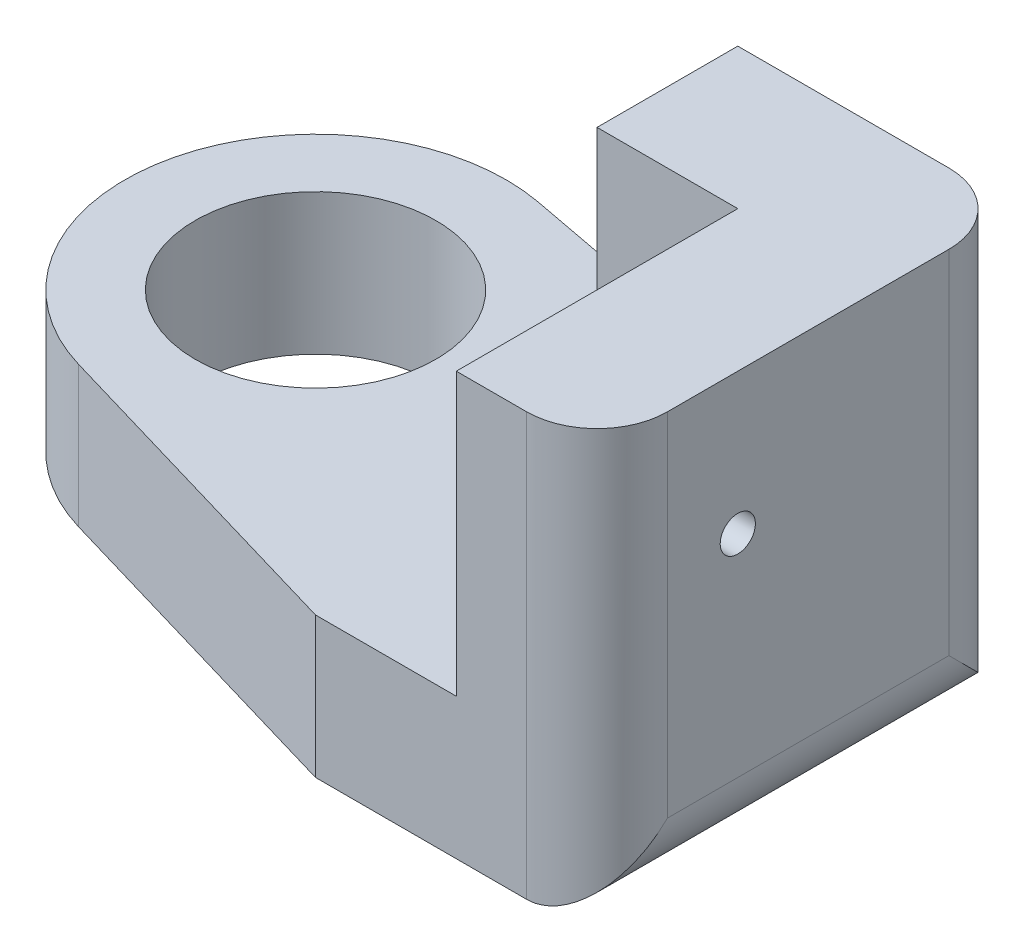
ISO-10303-21;
HEADER;
FILE_DESCRIPTION(('STEP AP214'),'2;1');
FILE_NAME('part.step','',(''),(''),'','','');
FILE_SCHEMA(('AUTOMOTIVE_DESIGN { 1 0 10303 214 1 1 1 1 }'));
ENDSEC;
DATA;
#1=APPLICATION_CONTEXT('core data for automotive mechanical design processes');
#2=APPLICATION_PROTOCOL_DEFINITION('international standard','automotive_design',2000,#1);
#3=PRODUCT_CONTEXT('',#1,'mechanical');
#4=PRODUCT('Part','Part','',(#3));
#5=PRODUCT_RELATED_PRODUCT_CATEGORY('part','',(#4));
#6=PRODUCT_DEFINITION_FORMATION('','',#4);
#7=PRODUCT_DEFINITION_CONTEXT('part definition',#1,'design');
#8=PRODUCT_DEFINITION('design','',#6,#7);
#9=PRODUCT_DEFINITION_SHAPE('','',#8);
#10=(LENGTH_UNIT() NAMED_UNIT(*) SI_UNIT(.MILLI.,.METRE.));
#11=(NAMED_UNIT(*) PLANE_ANGLE_UNIT() SI_UNIT($,.RADIAN.));
#12=(NAMED_UNIT(*) SI_UNIT($,.STERADIAN.) SOLID_ANGLE_UNIT());
#13=UNCERTAINTY_MEASURE_WITH_UNIT(LENGTH_MEASURE(1.E-05),#10,'distance_accuracy_value','');
#14=(GEOMETRIC_REPRESENTATION_CONTEXT(3) GLOBAL_UNCERTAINTY_ASSIGNED_CONTEXT((#13)) GLOBAL_UNIT_ASSIGNED_CONTEXT((#10,
#11,#12)) REPRESENTATION_CONTEXT('',''));
#15=CARTESIAN_POINT('',(0.,0.,0.));
#16=DIRECTION('',(0.,0.,1.));
#17=DIRECTION('',(1.,0.,0.));
#18=AXIS2_PLACEMENT_3D('',#15,#16,#17);
#19=CARTESIAN_POINT('',(0.,10.,0.));
#20=DIRECTION('',(1.,0.,0.));
#21=DIRECTION('',(0.,0.,-1.));
#22=AXIS2_PLACEMENT_3D('',#19,#20,#21);
#23=PLANE('',#22);
#24=DIRECTION('',(0.,-1.,0.));
#25=VECTOR('',#24,1.);
#26=CARTESIAN_POINT('',(0.,10.,0.));
#27=LINE('',#26,#25);
#28=CARTESIAN_POINT('',(0.,30.,0.));
#29=VERTEX_POINT('',#28);
#30=CARTESIAN_POINT('',(0.,15.,0.));
#31=VERTEX_POINT('',#30);
#32=EDGE_CURVE('E245',#29,#31,#27,.T.);
#33=ORIENTED_EDGE('',*,*,#32,.T.);
#34=DIRECTION('',(0.,0.,-1.));
#35=VECTOR('',#34,1.);
#36=CARTESIAN_POINT('',(0.,15.,0.));
#37=LINE('',#36,#35);
#38=CARTESIAN_POINT('',(0.,15.,10.));
#39=VERTEX_POINT('',#38);
#40=EDGE_CURVE('E261',#31,#39,#37,.F.);
#41=ORIENTED_EDGE('',*,*,#40,.T.);
#42=DIRECTION('',(0.,-1.,0.));
#43=VECTOR('',#42,1.);
#44=CARTESIAN_POINT('',(0.,20.,10.));
#45=LINE('',#44,#43);
#46=CARTESIAN_POINT('',(0.,30.,10.));
#47=VERTEX_POINT('',#46);
#48=EDGE_CURVE('E237',#47,#39,#45,.T.);
#49=ORIENTED_EDGE('',*,*,#48,.F.);
#50=DIRECTION('',(0.,0.,1.));
#51=VECTOR('',#50,1.);
#52=CARTESIAN_POINT('',(0.,30.,0.));
#53=LINE('',#52,#51);
#54=EDGE_CURVE('E185',#29,#47,#53,.T.);
#55=ORIENTED_EDGE('',*,*,#54,.F.);
#56=EDGE_LOOP('',(#33,#41,#49,#55));
#57=FACE_BOUND('',#56,.T.);
#58=ADVANCED_FACE('F39',(#57),#23,.F.);
#59=CARTESIAN_POINT('',(0.,10.,30.));
#60=DIRECTION('',(0.,0.,-1.));
#61=DIRECTION('',(-1.,0.,0.));
#62=AXIS2_PLACEMENT_3D('',#59,#60,#61);
#63=PLANE('',#62);
#64=DIRECTION('',(1.,0.,0.));
#65=VECTOR('',#64,1.);
#66=CARTESIAN_POINT('',(0.,0.,30.));
#67=LINE('',#66,#65);
#68=CARTESIAN_POINT('',(0.,0.,30.));
#69=VERTEX_POINT('',#68);
#70=CARTESIAN_POINT('',(15.,0.,30.));
#71=VERTEX_POINT('',#70);
#72=EDGE_CURVE('E241',#69,#71,#67,.T.);
#73=ORIENTED_EDGE('',*,*,#72,.T.);
#74=DIRECTION('',(0.,-1.,0.));
#75=VECTOR('',#74,1.);
#76=CARTESIAN_POINT('',(15.,10.,30.));
#77=LINE('',#76,#75);
#78=CARTESIAN_POINT('',(15.,30.,30.));
#79=VERTEX_POINT('',#78);
#80=EDGE_CURVE('E150',#71,#79,#77,.F.);
#81=ORIENTED_EDGE('',*,*,#80,.T.);
#82=DIRECTION('',(1.,0.,0.));
#83=VECTOR('',#82,1.);
#84=CARTESIAN_POINT('',(10.,30.,30.));
#85=LINE('',#84,#83);
#86=CARTESIAN_POINT('',(10.,30.,30.));
#87=VERTEX_POINT('',#86);
#88=EDGE_CURVE('E146',#87,#79,#85,.T.);
#89=ORIENTED_EDGE('',*,*,#88,.F.);
#90=DIRECTION('',(0.,-1.,0.));
#91=VECTOR('',#90,1.);
#92=CARTESIAN_POINT('',(10.,20.,30.));
#93=LINE('',#92,#91);
#94=CARTESIAN_POINT('',(10.,10.,30.));
#95=VERTEX_POINT('',#94);
#96=EDGE_CURVE('E134',#87,#95,#93,.T.);
#97=ORIENTED_EDGE('',*,*,#96,.T.);
#98=DIRECTION('',(1.,0.,0.));
#99=VECTOR('',#98,1.);
#100=CARTESIAN_POINT('',(0.,10.,30.));
#101=LINE('',#100,#99);
#102=CARTESIAN_POINT('',(0.,10.,30.));
#103=VERTEX_POINT('',#102);
#104=EDGE_CURVE('E242',#103,#95,#101,.T.);
#105=ORIENTED_EDGE('',*,*,#104,.F.);
#106=DIRECTION('',(0.,-1.,0.));
#107=VECTOR('',#106,1.);
#108=CARTESIAN_POINT('',(0.,10.,30.));
#109=LINE('',#108,#107);
#110=EDGE_CURVE('E253',#103,#69,#109,.T.);
#111=ORIENTED_EDGE('',*,*,#110,.T.);
#112=EDGE_LOOP('',(#73,#81,#89,#97,#105,#111));
#113=FACE_BOUND('',#112,.T.);
#114=ADVANCED_FACE('F148',(#113),#63,.F.);
#115=CARTESIAN_POINT('',(20.,10.,0.));
#116=DIRECTION('',(-1.,0.,0.));
#117=DIRECTION('',(0.,0.,1.));
#118=AXIS2_PLACEMENT_3D('',#115,#116,#117);
#119=PLANE('',#118);
#120=CARTESIAN_POINT('',(20.,20.,20.));
#121=DIRECTION('',(-1.,0.,0.));
#122=DIRECTION('',(0.,0.,1.));
#123=AXIS2_PLACEMENT_3D('',#120,#121,#122);
#124=CIRCLE('',#123,1.25);
#125=CARTESIAN_POINT('',(20.,20.,21.25));
#126=VERTEX_POINT('',#125);
#127=EDGE_CURVE('E163',#126,#126,#124,.F.);
#128=ORIENTED_EDGE('',*,*,#127,.F.);
#129=EDGE_LOOP('',(#128));
#130=FACE_BOUND('',#129,.T.);
#131=DIRECTION('',(0.,-1.,0.));
#132=VECTOR('',#131,1.);
#133=CARTESIAN_POINT('',(20.,10.,5.));
#134=LINE('',#133,#132);
#135=CARTESIAN_POINT('',(20.,5.,5.));
#136=VERTEX_POINT('',#135);
#137=CARTESIAN_POINT('',(20.,30.,5.));
#138=VERTEX_POINT('',#137);
#139=EDGE_CURVE('E264',#136,#138,#134,.F.);
#140=ORIENTED_EDGE('',*,*,#139,.T.);
#141=DIRECTION('',(0.,0.,-1.));
#142=VECTOR('',#141,1.);
#143=CARTESIAN_POINT('',(20.,30.,25.));
#144=LINE('',#143,#142);
#145=CARTESIAN_POINT('',(20.,30.,25.));
#146=VERTEX_POINT('',#145);
#147=EDGE_CURVE('E173',#146,#138,#144,.T.);
#148=ORIENTED_EDGE('',*,*,#147,.F.);
#149=DIRECTION('',(0.,-1.,0.));
#150=VECTOR('',#149,1.);
#151=CARTESIAN_POINT('',(20.,10.,25.));
#152=LINE('',#151,#150);
#153=CARTESIAN_POINT('',(20.,5.,25.));
#154=VERTEX_POINT('',#153);
#155=EDGE_CURVE('E271',#146,#154,#152,.T.);
#156=ORIENTED_EDGE('',*,*,#155,.T.);
#157=DIRECTION('',(0.,0.,-1.));
#158=VECTOR('',#157,1.);
#159=CARTESIAN_POINT('',(20.,5.,0.));
#160=LINE('',#159,#158);
#161=EDGE_CURVE('E267',#154,#136,#160,.T.);
#162=ORIENTED_EDGE('',*,*,#161,.T.);
#163=EDGE_LOOP('',(#140,#148,#156,#162));
#164=FACE_BOUND('',#163,.T.);
#165=ADVANCED_FACE('F297',(#130,#164),#119,.F.);
#166=CARTESIAN_POINT('',(0.,10.,0.));
#167=DIRECTION('',(0.,0.,1.));
#168=DIRECTION('',(1.,0.,0.));
#169=AXIS2_PLACEMENT_3D('',#166,#167,#168);
#170=PLANE('',#169);
#171=ORIENTED_EDGE('',*,*,#32,.F.);
#172=DIRECTION('',(-1.,0.,0.));
#173=VECTOR('',#172,1.);
#174=CARTESIAN_POINT('',(15.,30.,0.));
#175=LINE('',#174,#173);
#176=CARTESIAN_POINT('',(15.,30.,0.));
#177=VERTEX_POINT('',#176);
#178=EDGE_CURVE('E181',#177,#29,#175,.T.);
#179=ORIENTED_EDGE('',*,*,#178,.F.);
#180=DIRECTION('',(0.,-1.,0.));
#181=VECTOR('',#180,1.);
#182=CARTESIAN_POINT('',(15.,10.,0.));
#183=LINE('',#182,#181);
#184=CARTESIAN_POINT('',(15.,0.,0.));
#185=VERTEX_POINT('',#184);
#186=EDGE_CURVE('E63',#177,#185,#183,.T.);
#187=ORIENTED_EDGE('',*,*,#186,.T.);
#188=DIRECTION('',(-1.,0.,0.));
#189=VECTOR('',#188,1.);
#190=CARTESIAN_POINT('',(0.,0.,0.));
#191=LINE('',#190,#189);
#192=CARTESIAN_POINT('',(0.,0.,0.));
#193=VERTEX_POINT('',#192);
#194=EDGE_CURVE('E246',#185,#193,#191,.T.);
#195=ORIENTED_EDGE('',*,*,#194,.T.);
#196=DIRECTION('',(0.,1.,0.));
#197=VECTOR('',#196,1.);
#198=CARTESIAN_POINT('',(0.,-47.4468650176173,0.));
#199=LINE('',#198,#197);
#200=EDGE_CURVE('E57',#193,#31,#199,.T.);
#201=ORIENTED_EDGE('',*,*,#200,.T.);
#202=EDGE_LOOP('',(#171,#179,#187,#195,#201));
#203=FACE_BOUND('',#202,.T.);
#204=ADVANCED_FACE('F301',(#203),#170,.F.);
#205=CARTESIAN_POINT('',(0.,10.,0.));
#206=DIRECTION('',(0.,1.,0.));
#207=DIRECTION('',(0.,0.,1.));
#208=AXIS2_PLACEMENT_3D('',#205,#206,#207);
#209=PLANE('',#208);
#210=DIRECTION('',(1.,0.,0.));
#211=VECTOR('',#210,1.);
#212=CARTESIAN_POINT('',(0.,10.,10.));
#213=LINE('',#212,#211);
#214=CARTESIAN_POINT('',(-5.,10.,10.));
#215=VERTEX_POINT('',#214);
#216=CARTESIAN_POINT('',(10.,10.,10.));
#217=VERTEX_POINT('',#216);
#218=EDGE_CURVE('E229',#215,#217,#213,.T.);
#219=ORIENTED_EDGE('',*,*,#218,.F.);
#220=DIRECTION('',(0.,0.,-1.));
#221=VECTOR('',#220,1.);
#222=CARTESIAN_POINT('',(-5.,10.,0.));
#223=LINE('',#222,#221);
#224=CARTESIAN_POINT('',(-5.,10.,-0.947812380366816));
#225=VERTEX_POINT('',#224);
#226=EDGE_CURVE('E257',#215,#225,#223,.T.);
#227=ORIENTED_EDGE('',*,*,#226,.T.);
#228=DIRECTION('',(-0.982503193400875,0.,-0.186245738091056));
#229=VECTOR('',#228,1.);
#230=CARTESIAN_POINT('',(0.,10.,0.));
#231=LINE('',#230,#229);
#232=CARTESIAN_POINT('',(-17.5137222803635,10.,-3.31994456072693));
#233=VERTEX_POINT('',#232);
#234=EDGE_CURVE('E207',#225,#233,#231,.T.);
#235=ORIENTED_EDGE('',*,*,#234,.T.);
#236=CARTESIAN_POINT('',(-20.,10.,10.));
#237=DIRECTION('',(0.,1.,0.));
#238=DIRECTION('',(0.,0.,1.));
#239=AXIS2_PLACEMENT_3D('',#236,#237,#238);
#240=CIRCLE('',#239,13.55);
#241=CARTESIAN_POINT('',(-23.8463629734088,10.,22.9926129734088));
#242=VERTEX_POINT('',#241);
#243=EDGE_CURVE('E210',#233,#242,#240,.T.);
#244=ORIENTED_EDGE('',*,*,#243,.T.);
#245=DIRECTION('',(0.959433535303502,0.,0.28193490620181));
#246=VECTOR('',#245,1.);
#247=CARTESIAN_POINT('',(0.,10.,30.));
#248=LINE('',#247,#246);
#249=EDGE_CURVE('E214',#242,#103,#248,.T.);
#250=ORIENTED_EDGE('',*,*,#249,.T.);
#251=ORIENTED_EDGE('',*,*,#104,.T.);
#252=DIRECTION('',(0.,0.,1.));
#253=VECTOR('',#252,1.);
#254=CARTESIAN_POINT('',(10.,10.,10.));
#255=LINE('',#254,#253);
#256=EDGE_CURVE('E140',#217,#95,#255,.T.);
#257=ORIENTED_EDGE('',*,*,#256,.F.);
#258=EDGE_LOOP('',(#219,#227,#235,#244,#250,#251,#257));
#259=FACE_BOUND('',#258,.T.);
#260=CARTESIAN_POINT('',(-20.,10.,10.));
#261=DIRECTION('',(0.,1.,0.));
#262=DIRECTION('',(0.,0.,1.));
#263=AXIS2_PLACEMENT_3D('',#260,#261,#262);
#264=CIRCLE('',#263,8.55);
#265=CARTESIAN_POINT('',(-20.,10.,18.55));
#266=VERTEX_POINT('',#265);
#267=EDGE_CURVE('E203',#266,#266,#264,.T.);
#268=ORIENTED_EDGE('',*,*,#267,.F.);
#269=EDGE_LOOP('',(#268));
#270=FACE_BOUND('',#269,.T.);
#271=ADVANCED_FACE('F315',(#259,#270),#209,.T.);
#272=CARTESIAN_POINT('',(0.,0.,0.));
#273=DIRECTION('',(0.,1.,0.));
#274=DIRECTION('',(0.,0.,1.));
#275=AXIS2_PLACEMENT_3D('',#272,#273,#274);
#276=PLANE('',#275);
#277=ORIENTED_EDGE('',*,*,#194,.F.);
#278=DIRECTION('',(0.,0.,-1.));
#279=VECTOR('',#278,1.);
#280=CARTESIAN_POINT('',(15.,0.,0.));
#281=LINE('',#280,#279);
#282=EDGE_CURVE('E274',#185,#71,#281,.F.);
#283=ORIENTED_EDGE('',*,*,#282,.T.);
#284=ORIENTED_EDGE('',*,*,#72,.F.);
#285=DIRECTION('',(-0.959433535303502,0.,-0.28193490620181));
#286=VECTOR('',#285,1.);
#287=CARTESIAN_POINT('',(0.,0.,30.));
#288=LINE('',#287,#286);
#289=CARTESIAN_POINT('',(-23.8463629734088,0.,22.9926129734088));
#290=VERTEX_POINT('',#289);
#291=EDGE_CURVE('E196',#69,#290,#288,.T.);
#292=ORIENTED_EDGE('',*,*,#291,.T.);
#293=CARTESIAN_POINT('',(-20.,0.,10.));
#294=DIRECTION('',(0.,1.,0.));
#295=DIRECTION('',(0.,0.,1.));
#296=AXIS2_PLACEMENT_3D('',#293,#294,#295);
#297=CIRCLE('',#296,13.55);
#298=CARTESIAN_POINT('',(-17.5137222803635,0.,-3.31994456072693));
#299=VERTEX_POINT('',#298);
#300=EDGE_CURVE('E197',#290,#299,#297,.F.);
#301=ORIENTED_EDGE('',*,*,#300,.T.);
#302=DIRECTION('',(0.982503193400875,0.,0.186245738091056));
#303=VECTOR('',#302,1.);
#304=CARTESIAN_POINT('',(0.,0.,0.));
#305=LINE('',#304,#303);
#306=EDGE_CURVE('E191',#299,#193,#305,.T.);
#307=ORIENTED_EDGE('',*,*,#306,.T.);
#308=EDGE_LOOP('',(#277,#283,#284,#292,#301,#307));
#309=FACE_BOUND('',#308,.T.);
#310=CARTESIAN_POINT('',(-20.,0.,10.));
#311=DIRECTION('',(0.,1.,0.));
#312=DIRECTION('',(0.,0.,1.));
#313=AXIS2_PLACEMENT_3D('',#310,#311,#312);
#314=CIRCLE('',#313,8.55);
#315=CARTESIAN_POINT('',(-20.,0.,18.55));
#316=VERTEX_POINT('',#315);
#317=EDGE_CURVE('E195',#316,#316,#314,.F.);
#318=ORIENTED_EDGE('',*,*,#317,.F.);
#319=EDGE_LOOP('',(#318));
#320=FACE_BOUND('',#319,.T.);
#321=ADVANCED_FACE('F325',(#309,#320),#276,.F.);
#322=CARTESIAN_POINT('',(0.,20.,10.));
#323=DIRECTION('',(0.,0.,-1.));
#324=DIRECTION('',(-1.,0.,0.));
#325=AXIS2_PLACEMENT_3D('',#322,#323,#324);
#326=PLANE('',#325);
#327=ORIENTED_EDGE('',*,*,#218,.T.);
#328=DIRECTION('',(0.,-1.,0.));
#329=VECTOR('',#328,1.);
#330=CARTESIAN_POINT('',(10.,20.,10.));
#331=LINE('',#330,#329);
#332=CARTESIAN_POINT('',(10.,30.,10.));
#333=VERTEX_POINT('',#332);
#334=EDGE_CURVE('E143',#333,#217,#331,.T.);
#335=ORIENTED_EDGE('',*,*,#334,.F.);
#336=DIRECTION('',(1.,0.,0.));
#337=VECTOR('',#336,1.);
#338=CARTESIAN_POINT('',(0.,30.,10.));
#339=LINE('',#338,#337);
#340=EDGE_CURVE('E161',#47,#333,#339,.T.);
#341=ORIENTED_EDGE('',*,*,#340,.F.);
#342=ORIENTED_EDGE('',*,*,#48,.T.);
#343=CARTESIAN_POINT('',(-5.,15.,10.));
#344=DIRECTION('',(0.,0.,-1.));
#345=DIRECTION('',(-1.,0.,0.));
#346=AXIS2_PLACEMENT_3D('',#343,#344,#345);
#347=CIRCLE('',#346,5.);
#348=EDGE_CURVE('E11',#39,#215,#347,.T.);
#349=ORIENTED_EDGE('',*,*,#348,.T.);
#350=EDGE_LOOP('',(#327,#335,#341,#342,#349));
#351=FACE_BOUND('',#350,.T.);
#352=ADVANCED_FACE('F313',(#351),#326,.F.);
#353=CARTESIAN_POINT('',(10.,20.,10.));
#354=DIRECTION('',(1.,0.,0.));
#355=DIRECTION('',(0.,0.,-1.));
#356=AXIS2_PLACEMENT_3D('',#353,#354,#355);
#357=PLANE('',#356);
#358=CARTESIAN_POINT('',(10.,20.,20.));
#359=DIRECTION('',(-1.,0.,0.));
#360=DIRECTION('',(0.,0.,1.));
#361=AXIS2_PLACEMENT_3D('',#358,#359,#360);
#362=CIRCLE('',#361,1.25);
#363=CARTESIAN_POINT('',(10.,20.,21.25));
#364=VERTEX_POINT('',#363);
#365=EDGE_CURVE('E167',#364,#364,#362,.T.);
#366=ORIENTED_EDGE('',*,*,#365,.F.);
#367=EDGE_LOOP('',(#366));
#368=FACE_BOUND('',#367,.T.);
#369=ORIENTED_EDGE('',*,*,#256,.T.);
#370=ORIENTED_EDGE('',*,*,#96,.F.);
#371=DIRECTION('',(0.,0.,1.));
#372=VECTOR('',#371,1.);
#373=CARTESIAN_POINT('',(10.,30.,10.));
#374=LINE('',#373,#372);
#375=EDGE_CURVE('E139',#333,#87,#374,.T.);
#376=ORIENTED_EDGE('',*,*,#375,.F.);
#377=ORIENTED_EDGE('',*,*,#334,.T.);
#378=EDGE_LOOP('',(#369,#370,#376,#377));
#379=FACE_BOUND('',#378,.T.);
#380=ADVANCED_FACE('F136',(#368,#379),#357,.F.);
#381=CARTESIAN_POINT('',(0.,-47.4468650176173,0.));
#382=DIRECTION('',(0.186245738091056,0.,-0.982503193400875));
#383=DIRECTION('',(-0.982503193400875,0.,-0.186245738091056));
#384=AXIS2_PLACEMENT_3D('',#381,#382,#383);
#385=PLANE('',#384);
#386=ORIENTED_EDGE('',*,*,#306,.F.);
#387=DIRECTION('',(0.,1.,0.));
#388=VECTOR('',#387,1.);
#389=CARTESIAN_POINT('',(-17.5137222803635,-47.4468650176173,-3.31994456072693));
#390=LINE('',#389,#388);
#391=EDGE_CURVE('E220',#299,#233,#390,.T.);
#392=ORIENTED_EDGE('',*,*,#391,.T.);
#393=ORIENTED_EDGE('',*,*,#234,.F.);
#394=CARTESIAN_POINT('',(-5.,15.,-0.947812380366816));
#395=DIRECTION('',(0.186245738091056,0.,-0.982503193400875));
#396=DIRECTION('',(-0.982503193400875,0.,-0.186245738091056));
#397=AXIS2_PLACEMENT_3D('',#394,#395,#396);
#398=ELLIPSE('',#397,5.08904198335763,5.);
#399=EDGE_CURVE('E49',#225,#31,#398,.F.);
#400=ORIENTED_EDGE('',*,*,#399,.T.);
#401=ORIENTED_EDGE('',*,*,#200,.F.);
#402=EDGE_LOOP('',(#386,#392,#393,#400,#401));
#403=FACE_BOUND('',#402,.T.);
#404=ADVANCED_FACE('F307',(#403),#385,.T.);
#405=CARTESIAN_POINT('',(-20.,-47.4468650176173,10.));
#406=DIRECTION('',(0.,1.,0.));
#407=DIRECTION('',(0.,0.,1.));
#408=AXIS2_PLACEMENT_3D('',#405,#406,#407);
#409=CYLINDRICAL_SURFACE('',#408,13.55);
#410=ORIENTED_EDGE('',*,*,#300,.F.);
#411=DIRECTION('',(0.,1.,0.));
#412=VECTOR('',#411,1.);
#413=CARTESIAN_POINT('',(-23.8463629734088,-47.4468650176173,22.9926129734088));
#414=LINE('',#413,#412);
#415=EDGE_CURVE('E200',#290,#242,#414,.T.);
#416=ORIENTED_EDGE('',*,*,#415,.T.);
#417=ORIENTED_EDGE('',*,*,#243,.F.);
#418=ORIENTED_EDGE('',*,*,#391,.F.);
#419=EDGE_LOOP('',(#410,#416,#417,#418));
#420=FACE_BOUND('',#419,.T.);
#421=ADVANCED_FACE('F329',(#420),#409,.T.);
#422=CARTESIAN_POINT('',(0.,-47.4468650176173,30.));
#423=DIRECTION('',(-0.28193490620181,0.,0.959433535303502));
#424=DIRECTION('',(0.959433535303502,0.,0.28193490620181));
#425=AXIS2_PLACEMENT_3D('',#422,#423,#424);
#426=PLANE('',#425);
#427=ORIENTED_EDGE('',*,*,#291,.F.);
#428=ORIENTED_EDGE('',*,*,#110,.F.);
#429=ORIENTED_EDGE('',*,*,#249,.F.);
#430=ORIENTED_EDGE('',*,*,#415,.F.);
#431=EDGE_LOOP('',(#427,#428,#429,#430));
#432=FACE_BOUND('',#431,.T.);
#433=ADVANCED_FACE('F321',(#432),#426,.T.);
#434=CARTESIAN_POINT('',(-20.,-47.4468650176173,10.));
#435=DIRECTION('',(0.,1.,0.));
#436=DIRECTION('',(0.,0.,1.));
#437=AXIS2_PLACEMENT_3D('',#434,#435,#436);
#438=CYLINDRICAL_SURFACE('',#437,8.55);
#439=ORIENTED_EDGE('',*,*,#317,.T.);
#440=EDGE_LOOP('',(#439));
#441=FACE_BOUND('',#440,.T.);
#442=ORIENTED_EDGE('',*,*,#267,.T.);
#443=EDGE_LOOP('',(#442));
#444=FACE_BOUND('',#443,.T.);
#445=ADVANCED_FACE('F337',(#441,#444),#438,.F.);
#446=CARTESIAN_POINT('',(-5.,15.,0.));
#447=DIRECTION('',(0.,0.,-1.));
#448=DIRECTION('',(-1.,0.,0.));
#449=AXIS2_PLACEMENT_3D('',#446,#447,#448);
#450=CYLINDRICAL_SURFACE('',#449,5.);
#451=ORIENTED_EDGE('',*,*,#348,.F.);
#452=ORIENTED_EDGE('',*,*,#40,.F.);
#453=ORIENTED_EDGE('',*,*,#399,.F.);
#454=ORIENTED_EDGE('',*,*,#226,.F.);
#455=EDGE_LOOP('',(#451,#452,#453,#454));
#456=FACE_BOUND('',#455,.T.);
#457=ADVANCED_FACE('F311',(#456),#450,.F.);
#458=CARTESIAN_POINT('',(15.,10.,25.));
#459=DIRECTION('',(0.,-1.,0.));
#460=DIRECTION('',(0.,0.,-1.));
#461=AXIS2_PLACEMENT_3D('',#458,#459,#460);
#462=CYLINDRICAL_SURFACE('',#461,5.);
#463=ORIENTED_EDGE('',*,*,#155,.F.);
#464=CARTESIAN_POINT('',(15.,30.,25.));
#465=DIRECTION('',(0.,1.,0.));
#466=DIRECTION('',(0.,0.,1.));
#467=AXIS2_PLACEMENT_3D('',#464,#465,#466);
#468=CIRCLE('',#467,5.);
#469=EDGE_CURVE('E155',#79,#146,#468,.T.);
#470=ORIENTED_EDGE('',*,*,#469,.F.);
#471=ORIENTED_EDGE('',*,*,#80,.F.);
#472=CARTESIAN_POINT('',(15.,5.,25.));
#473=DIRECTION('',(0.,-0.707106781186547,-0.707106781186547));
#474=DIRECTION('',(0.,-0.707106781186547,0.707106781186547));
#475=AXIS2_PLACEMENT_3D('',#472,#473,#474);
#476=ELLIPSE('',#475,7.07106781186547,5.);
#477=EDGE_CURVE('E43',#154,#71,#476,.T.);
#478=ORIENTED_EDGE('',*,*,#477,.F.);
#479=EDGE_LOOP('',(#463,#470,#471,#478));
#480=FACE_BOUND('',#479,.T.);
#481=ADVANCED_FACE('F41',(#480),#462,.T.);
#482=CARTESIAN_POINT('',(15.,10.,5.));
#483=DIRECTION('',(0.,-1.,0.));
#484=DIRECTION('',(0.,0.,-1.));
#485=AXIS2_PLACEMENT_3D('',#482,#483,#484);
#486=CYLINDRICAL_SURFACE('',#485,5.);
#487=ORIENTED_EDGE('',*,*,#186,.F.);
#488=CARTESIAN_POINT('',(15.,30.,5.));
#489=DIRECTION('',(0.,1.,0.));
#490=DIRECTION('',(0.,0.,1.));
#491=AXIS2_PLACEMENT_3D('',#488,#489,#490);
#492=CIRCLE('',#491,5.);
#493=EDGE_CURVE('E177',#138,#177,#492,.T.);
#494=ORIENTED_EDGE('',*,*,#493,.F.);
#495=ORIENTED_EDGE('',*,*,#139,.F.);
#496=CARTESIAN_POINT('',(15.,5.,5.));
#497=DIRECTION('',(0.,-0.707106781186547,0.707106781186547));
#498=DIRECTION('',(0.,-0.707106781186547,-0.707106781186547));
#499=AXIS2_PLACEMENT_3D('',#496,#497,#498);
#500=ELLIPSE('',#499,7.07106781186547,5.);
#501=EDGE_CURVE('E190',#185,#136,#500,.T.);
#502=ORIENTED_EDGE('',*,*,#501,.F.);
#503=EDGE_LOOP('',(#487,#494,#495,#502));
#504=FACE_BOUND('',#503,.T.);
#505=ADVANCED_FACE('F299',(#504),#486,.T.);
#506=CARTESIAN_POINT('',(15.,5.,0.));
#507=DIRECTION('',(0.,0.,-1.));
#508=DIRECTION('',(-1.,0.,0.));
#509=AXIS2_PLACEMENT_3D('',#506,#507,#508);
#510=CYLINDRICAL_SURFACE('',#509,5.);
#511=ORIENTED_EDGE('',*,*,#477,.T.);
#512=ORIENTED_EDGE('',*,*,#282,.F.);
#513=ORIENTED_EDGE('',*,*,#501,.T.);
#514=ORIENTED_EDGE('',*,*,#161,.F.);
#515=EDGE_LOOP('',(#511,#512,#513,#514));
#516=FACE_BOUND('',#515,.T.);
#517=ADVANCED_FACE('F292',(#516),#510,.T.);
#518=CARTESIAN_POINT('',(15.,30.,25.));
#519=DIRECTION('',(0.,1.,0.));
#520=DIRECTION('',(0.,0.,1.));
#521=AXIS2_PLACEMENT_3D('',#518,#519,#520);
#522=PLANE('',#521);
#523=ORIENTED_EDGE('',*,*,#375,.T.);
#524=ORIENTED_EDGE('',*,*,#88,.T.);
#525=ORIENTED_EDGE('',*,*,#469,.T.);
#526=ORIENTED_EDGE('',*,*,#147,.T.);
#527=ORIENTED_EDGE('',*,*,#493,.T.);
#528=ORIENTED_EDGE('',*,*,#178,.T.);
#529=ORIENTED_EDGE('',*,*,#54,.T.);
#530=ORIENTED_EDGE('',*,*,#340,.T.);
#531=EDGE_LOOP('',(#523,#524,#525,#526,#527,#528,#529,#530));
#532=FACE_BOUND('',#531,.T.);
#533=ADVANCED_FACE('F158',(#532),#522,.T.);
#534=CARTESIAN_POINT('',(23.5355339059327,20.,20.));
#535=DIRECTION('',(-1.,0.,0.));
#536=DIRECTION('',(0.,0.,1.));
#537=AXIS2_PLACEMENT_3D('',#534,#535,#536);
#538=CYLINDRICAL_SURFACE('',#537,1.25);
#539=ORIENTED_EDGE('',*,*,#127,.T.);
#540=EDGE_LOOP('',(#539));
#541=FACE_BOUND('',#540,.T.);
#542=ORIENTED_EDGE('',*,*,#365,.T.);
#543=EDGE_LOOP('',(#542));
#544=FACE_BOUND('',#543,.T.);
#545=ADVANCED_FACE('F490',(#541,#544),#538,.F.);
#546=CLOSED_SHELL('',(#58,#114,#165,#204,#271,#321,#352,#380,#404,#421,#433,#445,#457,#481,#505,
#517,#533,#545));
#547=MANIFOLD_SOLID_BREP('B2',#546);
#548=ADVANCED_BREP_SHAPE_REPRESENTATION('',(#18,#547),#14);
#549=SHAPE_DEFINITION_REPRESENTATION(#9,#548);
ENDSEC;
END-ISO-10303-21;
